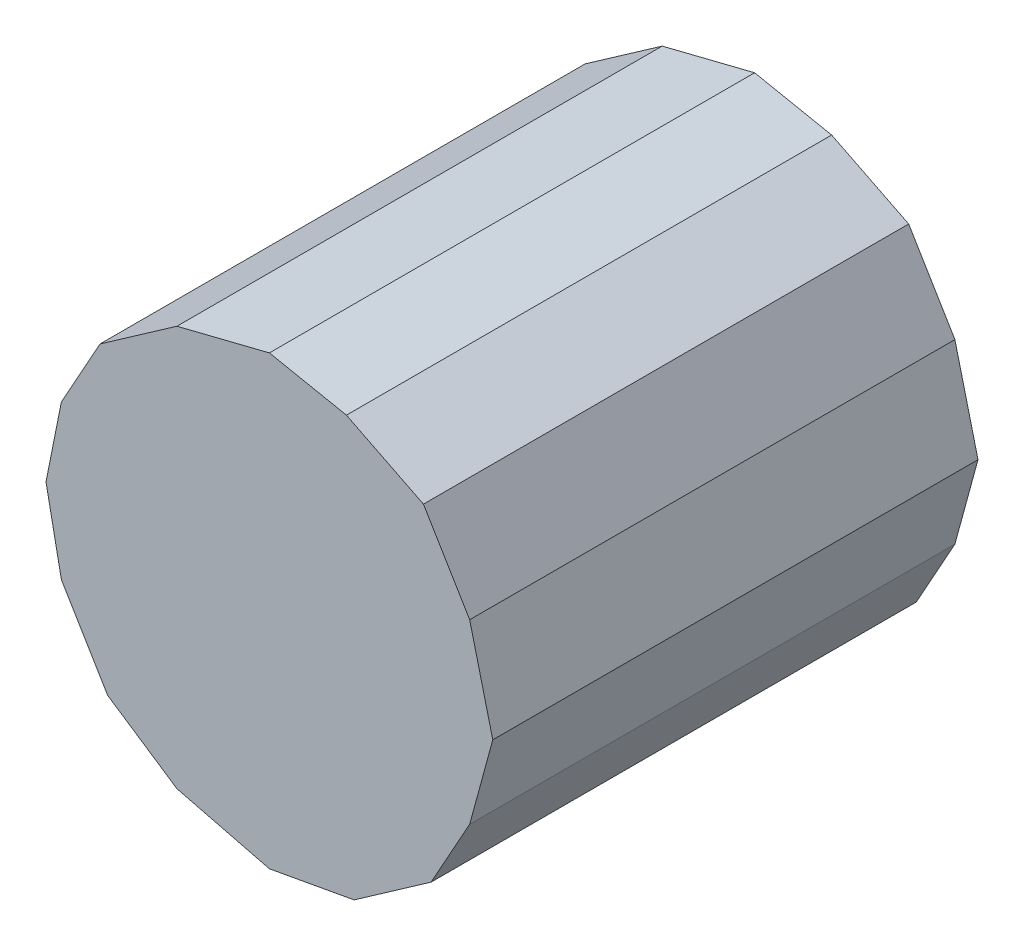
ISO-10303-21;
HEADER;
FILE_DESCRIPTION(('STEP AP214'),'2;1');
FILE_NAME('part.step','',(''),(''),'','','');
FILE_SCHEMA(('AUTOMOTIVE_DESIGN { 1 0 10303 214 1 1 1 1 }'));
ENDSEC;
DATA;
#1=APPLICATION_CONTEXT('core data for automotive mechanical design processes');
#2=APPLICATION_PROTOCOL_DEFINITION('international standard','automotive_design',2000,#1);
#3=PRODUCT_CONTEXT('',#1,'mechanical');
#4=PRODUCT('Part','Part','',(#3));
#5=PRODUCT_RELATED_PRODUCT_CATEGORY('part','',(#4));
#6=PRODUCT_DEFINITION_FORMATION('','',#4);
#7=PRODUCT_DEFINITION_CONTEXT('part definition',#1,'design');
#8=PRODUCT_DEFINITION('design','',#6,#7);
#9=PRODUCT_DEFINITION_SHAPE('','',#8);
#10=(LENGTH_UNIT() NAMED_UNIT(*) SI_UNIT(.MILLI.,.METRE.));
#11=(NAMED_UNIT(*) PLANE_ANGLE_UNIT() SI_UNIT($,.RADIAN.));
#12=(NAMED_UNIT(*) SI_UNIT($,.STERADIAN.) SOLID_ANGLE_UNIT());
#13=UNCERTAINTY_MEASURE_WITH_UNIT(LENGTH_MEASURE(1.E-05),#10,'distance_accuracy_value','');
#14=(GEOMETRIC_REPRESENTATION_CONTEXT(3) GLOBAL_UNCERTAINTY_ASSIGNED_CONTEXT((#13)) GLOBAL_UNIT_ASSIGNED_CONTEXT((#10,
#11,#12)) REPRESENTATION_CONTEXT('',''));
#15=CARTESIAN_POINT('',(0.,0.,0.));
#16=DIRECTION('',(0.,0.,1.));
#17=DIRECTION('',(1.,0.,0.));
#18=AXIS2_PLACEMENT_3D('',#15,#16,#17);
#19=CARTESIAN_POINT('',(0.,3.683,0.));
#20=DIRECTION('',(0.242535625036098,-0.970142500145391,0.));
#21=DIRECTION('',(0.970142500145391,0.242535625036098,0.));
#22=AXIS2_PLACEMENT_3D('',#19,#20,#21);
#23=PLANE('',#22);
#24=DIRECTION('',(0.,0.,1.));
#25=VECTOR('',#24,1.);
#26=CARTESIAN_POINT('',(-1.524,3.302,0.));
#27=LINE('',#26,#25);
#28=CARTESIAN_POINT('',(-1.52400000000005,3.30200000000018,0.));
#29=VERTEX_POINT('',#28);
#30=CARTESIAN_POINT('',(-1.52400000000005,3.30200000000018,8.));
#31=VERTEX_POINT('',#30);
#32=EDGE_CURVE('E140',#29,#31,#27,.T.);
#33=ORIENTED_EDGE('',*,*,#32,.T.);
#34=DIRECTION('',(0.970142500145391,0.242535625036098,0.));
#35=VECTOR('',#34,1.);
#36=CARTESIAN_POINT('',(0.,3.683,8.));
#37=LINE('',#36,#35);
#38=CARTESIAN_POINT('',(0.,3.68299999999994,8.));
#39=VERTEX_POINT('',#38);
#40=EDGE_CURVE('E20',#39,#31,#37,.F.);
#41=ORIENTED_EDGE('',*,*,#40,.F.);
#42=DIRECTION('',(0.,0.,1.));
#43=VECTOR('',#42,1.);
#44=CARTESIAN_POINT('',(0.,3.68299999999975,0.));
#45=LINE('',#44,#43);
#46=CARTESIAN_POINT('',(0.,3.68299999999994,0.));
#47=VERTEX_POINT('',#46);
#48=EDGE_CURVE('E156',#39,#47,#45,.F.);
#49=ORIENTED_EDGE('',*,*,#48,.T.);
#50=DIRECTION('',(0.970142500145391,0.242535625036098,0.));
#51=VECTOR('',#50,1.);
#52=CARTESIAN_POINT('',(0.,3.683,0.));
#53=LINE('',#52,#51);
#54=EDGE_CURVE('E126',#29,#47,#53,.T.);
#55=ORIENTED_EDGE('',*,*,#54,.F.);
#56=EDGE_LOOP('',(#33,#41,#49,#55));
#57=FACE_BOUND('',#56,.T.);
#58=ADVANCED_FACE('F17',(#57),#23,.F.);
#59=CARTESIAN_POINT('',(-1.524,3.302,0.));
#60=DIRECTION('',(0.573462344363127,-0.819231920519181,0.));
#61=DIRECTION('',(0.819231920519181,0.573462344363127,0.));
#62=AXIS2_PLACEMENT_3D('',#59,#60,#61);
#63=PLANE('',#62);
#64=DIRECTION('',(0.,0.,1.));
#65=VECTOR('',#64,1.);
#66=CARTESIAN_POINT('',(-2.794,2.413,0.));
#67=LINE('',#66,#65);
#68=CARTESIAN_POINT('',(-2.79400000000011,2.41300000000016,0.));
#69=VERTEX_POINT('',#68);
#70=CARTESIAN_POINT('',(-2.79400000000011,2.41300000000016,8.));
#71=VERTEX_POINT('',#70);
#72=EDGE_CURVE('E145',#69,#71,#67,.T.);
#73=ORIENTED_EDGE('',*,*,#72,.T.);
#74=DIRECTION('',(0.819231920519181,0.573462344363127,0.));
#75=VECTOR('',#74,1.);
#76=CARTESIAN_POINT('',(-1.524,3.302,8.));
#77=LINE('',#76,#75);
#78=EDGE_CURVE('E134',#31,#71,#77,.F.);
#79=ORIENTED_EDGE('',*,*,#78,.F.);
#80=ORIENTED_EDGE('',*,*,#32,.F.);
#81=DIRECTION('',(0.819231920519181,0.573462344363127,0.));
#82=VECTOR('',#81,1.);
#83=CARTESIAN_POINT('',(-1.524,3.302,0.));
#84=LINE('',#83,#82);
#85=EDGE_CURVE('E147',#69,#29,#84,.T.);
#86=ORIENTED_EDGE('',*,*,#85,.F.);
#87=EDGE_LOOP('',(#73,#79,#80,#86));
#88=FACE_BOUND('',#87,.T.);
#89=ADVANCED_FACE('F143',(#88),#63,.F.);
#90=CARTESIAN_POINT('',(1.27,3.429,0.));
#91=DIRECTION('',(-0.196116135137992,-0.980580675690959,0.));
#92=DIRECTION('',(0.980580675690959,-0.196116135137992,0.));
#93=AXIS2_PLACEMENT_3D('',#90,#91,#92);
#94=PLANE('',#93);
#95=ORIENTED_EDGE('',*,*,#48,.F.);
#96=DIRECTION('',(0.980580675690959,-0.196116135137992,0.));
#97=VECTOR('',#96,1.);
#98=CARTESIAN_POINT('',(1.27,3.429,8.));
#99=LINE('',#98,#97);
#100=CARTESIAN_POINT('',(1.27,3.429,8.));
#101=VERTEX_POINT('',#100);
#102=EDGE_CURVE('E137',#101,#39,#99,.F.);
#103=ORIENTED_EDGE('',*,*,#102,.F.);
#104=DIRECTION('',(0.,0.,1.));
#105=VECTOR('',#104,1.);
#106=CARTESIAN_POINT('',(1.27,3.429,0.));
#107=LINE('',#106,#105);
#108=CARTESIAN_POINT('',(1.27,3.429,0.));
#109=VERTEX_POINT('',#108);
#110=EDGE_CURVE('E161',#101,#109,#107,.F.);
#111=ORIENTED_EDGE('',*,*,#110,.T.);
#112=DIRECTION('',(0.980580675690959,-0.196116135137992,0.));
#113=VECTOR('',#112,1.);
#114=CARTESIAN_POINT('',(1.27,3.429,0.));
#115=LINE('',#114,#113);
#116=EDGE_CURVE('E153',#47,#109,#115,.T.);
#117=ORIENTED_EDGE('',*,*,#116,.F.);
#118=EDGE_LOOP('',(#95,#103,#111,#117));
#119=FACE_BOUND('',#118,.T.);
#120=ADVANCED_FACE('F159',(#119),#94,.F.);
#121=CARTESIAN_POINT('',(-2.794,2.413,0.));
#122=DIRECTION('',(0.874157276121255,-0.485642931179142,0.));
#123=DIRECTION('',(0.485642931179142,0.874157276121255,0.));
#124=AXIS2_PLACEMENT_3D('',#121,#122,#123);
#125=PLANE('',#124);
#126=DIRECTION('',(0.,0.,1.));
#127=VECTOR('',#126,1.);
#128=CARTESIAN_POINT('',(-3.429,1.27,0.));
#129=LINE('',#128,#127);
#130=CARTESIAN_POINT('',(-3.42900000000033,1.27000000000018,0.));
#131=VERTEX_POINT('',#130);
#132=CARTESIAN_POINT('',(-3.42900000000033,1.27000000000018,8.));
#133=VERTEX_POINT('',#132);
#134=EDGE_CURVE('E175',#131,#133,#129,.T.);
#135=ORIENTED_EDGE('',*,*,#134,.T.);
#136=DIRECTION('',(0.485642931179142,0.874157276121255,0.));
#137=VECTOR('',#136,1.);
#138=CARTESIAN_POINT('',(-2.794,2.413,8.));
#139=LINE('',#138,#137);
#140=EDGE_CURVE('E164',#71,#133,#139,.F.);
#141=ORIENTED_EDGE('',*,*,#140,.F.);
#142=ORIENTED_EDGE('',*,*,#72,.F.);
#143=DIRECTION('',(0.485642931179142,0.874157276121255,0.));
#144=VECTOR('',#143,1.);
#145=CARTESIAN_POINT('',(-2.794,2.413,0.));
#146=LINE('',#145,#144);
#147=EDGE_CURVE('E168',#131,#69,#146,.T.);
#148=ORIENTED_EDGE('',*,*,#147,.F.);
#149=EDGE_LOOP('',(#135,#141,#142,#148));
#150=FACE_BOUND('',#149,.T.);
#151=ADVANCED_FACE('F285',(#150),#125,.F.);
#152=CARTESIAN_POINT('',(2.54,2.794,0.));
#153=DIRECTION('',(-0.447213595499958,-0.894427190999916,0.));
#154=DIRECTION('',(0.894427190999916,-0.447213595499958,0.));
#155=AXIS2_PLACEMENT_3D('',#152,#153,#154);
#156=PLANE('',#155);
#157=ORIENTED_EDGE('',*,*,#110,.F.);
#158=DIRECTION('',(0.894427190999916,-0.447213595499958,0.));
#159=VECTOR('',#158,1.);
#160=CARTESIAN_POINT('',(2.54,2.794,8.));
#161=LINE('',#160,#159);
#162=CARTESIAN_POINT('',(2.53999999999978,2.79399999999987,8.));
#163=VERTEX_POINT('',#162);
#164=EDGE_CURVE('E170',#163,#101,#161,.F.);
#165=ORIENTED_EDGE('',*,*,#164,.F.);
#166=DIRECTION('',(0.,0.,1.));
#167=VECTOR('',#166,1.);
#168=CARTESIAN_POINT('',(2.53999999999913,2.79399999999948,0.));
#169=LINE('',#168,#167);
#170=CARTESIAN_POINT('',(2.53999999999978,2.79399999999987,0.));
#171=VERTEX_POINT('',#170);
#172=EDGE_CURVE('E185',#163,#171,#169,.F.);
#173=ORIENTED_EDGE('',*,*,#172,.T.);
#174=DIRECTION('',(0.894427190999916,-0.447213595499958,0.));
#175=VECTOR('',#174,1.);
#176=CARTESIAN_POINT('',(2.54,2.794,0.));
#177=LINE('',#176,#175);
#178=EDGE_CURVE('E173',#109,#171,#177,.T.);
#179=ORIENTED_EDGE('',*,*,#178,.F.);
#180=EDGE_LOOP('',(#157,#165,#173,#179));
#181=FACE_BOUND('',#180,.T.);
#182=ADVANCED_FACE('F307',(#181),#156,.F.);
#183=CARTESIAN_POINT('',(-3.429,1.27,0.));
#184=DIRECTION('',(0.980580675690959,-0.196116135137992,0.));
#185=DIRECTION('',(0.196116135137992,0.980580675690959,0.));
#186=AXIS2_PLACEMENT_3D('',#183,#184,#185);
#187=PLANE('',#186);
#188=DIRECTION('',(0.,0.,1.));
#189=VECTOR('',#188,1.);
#190=CARTESIAN_POINT('',(-3.683,0.,0.));
#191=LINE('',#190,#189);
#192=CARTESIAN_POINT('',(-3.68299999999988,0.,0.));
#193=VERTEX_POINT('',#192);
#194=CARTESIAN_POINT('',(-3.68299999999988,0.,8.));
#195=VERTEX_POINT('',#194);
#196=EDGE_CURVE('E190',#193,#195,#191,.T.);
#197=ORIENTED_EDGE('',*,*,#196,.T.);
#198=DIRECTION('',(0.196116135137992,0.980580675690959,0.));
#199=VECTOR('',#198,1.);
#200=CARTESIAN_POINT('',(-3.429,1.27,8.));
#201=LINE('',#200,#199);
#202=EDGE_CURVE('E178',#133,#195,#201,.F.);
#203=ORIENTED_EDGE('',*,*,#202,.F.);
#204=ORIENTED_EDGE('',*,*,#134,.F.);
#205=DIRECTION('',(0.196116135137992,0.980580675690959,0.));
#206=VECTOR('',#205,1.);
#207=CARTESIAN_POINT('',(-3.429,1.27,0.));
#208=LINE('',#207,#206);
#209=EDGE_CURVE('E180',#193,#131,#208,.T.);
#210=ORIENTED_EDGE('',*,*,#209,.F.);
#211=EDGE_LOOP('',(#197,#203,#204,#210));
#212=FACE_BOUND('',#211,.T.);
#213=ADVANCED_FACE('F283',(#212),#187,.F.);
#214=CARTESIAN_POINT('',(3.302,1.524,0.));
#215=DIRECTION('',(-0.857492925712191,-0.514495755428115,0.));
#216=DIRECTION('',(0.514495755428115,-0.857492925712191,0.));
#217=AXIS2_PLACEMENT_3D('',#214,#215,#216);
#218=PLANE('',#217);
#219=ORIENTED_EDGE('',*,*,#172,.F.);
#220=DIRECTION('',(0.514495755428115,-0.857492925712191,0.));
#221=VECTOR('',#220,1.);
#222=CARTESIAN_POINT('',(3.302,1.524,8.));
#223=LINE('',#222,#221);
#224=CARTESIAN_POINT('',(3.30200000000009,1.52400000000002,8.));
#225=VERTEX_POINT('',#224);
#226=EDGE_CURVE('E183',#225,#163,#223,.F.);
#227=ORIENTED_EDGE('',*,*,#226,.F.);
#228=DIRECTION('',(0.,0.,1.));
#229=VECTOR('',#228,1.);
#230=CARTESIAN_POINT('',(3.30200000000037,1.52400000000009,0.));
#231=LINE('',#230,#229);
#232=CARTESIAN_POINT('',(3.30200000000009,1.52400000000002,0.));
#233=VERTEX_POINT('',#232);
#234=EDGE_CURVE('E200',#225,#233,#231,.F.);
#235=ORIENTED_EDGE('',*,*,#234,.T.);
#236=DIRECTION('',(0.514495755428115,-0.857492925712191,0.));
#237=VECTOR('',#236,1.);
#238=CARTESIAN_POINT('',(3.302,1.524,0.));
#239=LINE('',#238,#237);
#240=EDGE_CURVE('E188',#171,#233,#239,.T.);
#241=ORIENTED_EDGE('',*,*,#240,.F.);
#242=EDGE_LOOP('',(#219,#227,#235,#241));
#243=FACE_BOUND('',#242,.T.);
#244=ADVANCED_FACE('F304',(#243),#218,.F.);
#245=CARTESIAN_POINT('',(-3.683,0.,0.));
#246=DIRECTION('',(0.980580675690959,0.196116135137992,0.));
#247=DIRECTION('',(-0.196116135137992,0.980580675690959,0.));
#248=AXIS2_PLACEMENT_3D('',#245,#246,#247);
#249=PLANE('',#248);
#250=DIRECTION('',(0.,0.,1.));
#251=VECTOR('',#250,1.);
#252=CARTESIAN_POINT('',(-3.429,-1.27,0.));
#253=LINE('',#252,#251);
#254=CARTESIAN_POINT('',(-3.42900000000012,-1.27000000000003,0.));
#255=VERTEX_POINT('',#254);
#256=CARTESIAN_POINT('',(-3.42900000000012,-1.27000000000003,8.));
#257=VERTEX_POINT('',#256);
#258=EDGE_CURVE('E205',#255,#257,#253,.T.);
#259=ORIENTED_EDGE('',*,*,#258,.T.);
#260=DIRECTION('',(-0.196116135137992,0.980580675690959,0.));
#261=VECTOR('',#260,1.);
#262=CARTESIAN_POINT('',(-3.683,0.,8.));
#263=LINE('',#262,#261);
#264=EDGE_CURVE('E193',#195,#257,#263,.F.);
#265=ORIENTED_EDGE('',*,*,#264,.F.);
#266=ORIENTED_EDGE('',*,*,#196,.F.);
#267=DIRECTION('',(-0.196116135137992,0.980580675690959,0.));
#268=VECTOR('',#267,1.);
#269=CARTESIAN_POINT('',(-3.683,0.,0.));
#270=LINE('',#269,#268);
#271=EDGE_CURVE('E195',#255,#193,#270,.T.);
#272=ORIENTED_EDGE('',*,*,#271,.F.);
#273=EDGE_LOOP('',(#259,#265,#266,#272));
#274=FACE_BOUND('',#273,.T.);
#275=ADVANCED_FACE('F280',(#274),#249,.F.);
#276=CARTESIAN_POINT('',(3.683,0.,0.));
#277=DIRECTION('',(-0.970142500145391,-0.242535625036098,0.));
#278=DIRECTION('',(0.242535625036098,-0.970142500145391,0.));
#279=AXIS2_PLACEMENT_3D('',#276,#277,#278);
#280=PLANE('',#279);
#281=ORIENTED_EDGE('',*,*,#234,.F.);
#282=DIRECTION('',(0.242535625036098,-0.970142500145391,0.));
#283=VECTOR('',#282,1.);
#284=CARTESIAN_POINT('',(3.683,0.,8.));
#285=LINE('',#284,#283);
#286=CARTESIAN_POINT('',(3.68299999999994,0.,8.));
#287=VERTEX_POINT('',#286);
#288=EDGE_CURVE('E198',#287,#225,#285,.F.);
#289=ORIENTED_EDGE('',*,*,#288,.F.);
#290=DIRECTION('',(0.,0.,1.));
#291=VECTOR('',#290,1.);
#292=CARTESIAN_POINT('',(3.68299999999976,0.,0.));
#293=LINE('',#292,#291);
#294=CARTESIAN_POINT('',(3.68299999999994,0.,0.));
#295=VERTEX_POINT('',#294);
#296=EDGE_CURVE('E215',#287,#295,#293,.F.);
#297=ORIENTED_EDGE('',*,*,#296,.T.);
#298=DIRECTION('',(0.242535625036098,-0.970142500145391,0.));
#299=VECTOR('',#298,1.);
#300=CARTESIAN_POINT('',(3.683,0.,0.));
#301=LINE('',#300,#299);
#302=EDGE_CURVE('E203',#233,#295,#301,.T.);
#303=ORIENTED_EDGE('',*,*,#302,.F.);
#304=EDGE_LOOP('',(#281,#289,#297,#303));
#305=FACE_BOUND('',#304,.T.);
#306=ADVANCED_FACE('F299',(#305),#280,.F.);
#307=CARTESIAN_POINT('',(-3.429,-1.27,0.));
#308=DIRECTION('',(0.857492925712191,0.514495755428115,0.));
#309=DIRECTION('',(-0.514495755428115,0.857492925712191,0.));
#310=AXIS2_PLACEMENT_3D('',#307,#308,#309);
#311=PLANE('',#310);
#312=DIRECTION('',(0.,0.,1.));
#313=VECTOR('',#312,1.);
#314=CARTESIAN_POINT('',(-2.667,-2.54,0.));
#315=LINE('',#314,#313);
#316=CARTESIAN_POINT('',(-2.66699999999956,-2.53999999999974,0.));
#317=VERTEX_POINT('',#316);
#318=CARTESIAN_POINT('',(-2.66699999999956,-2.53999999999974,8.));
#319=VERTEX_POINT('',#318);
#320=EDGE_CURVE('E220',#317,#319,#315,.T.);
#321=ORIENTED_EDGE('',*,*,#320,.T.);
#322=DIRECTION('',(-0.514495755428115,0.857492925712191,0.));
#323=VECTOR('',#322,1.);
#324=CARTESIAN_POINT('',(-3.429,-1.27,8.));
#325=LINE('',#324,#323);
#326=EDGE_CURVE('E208',#257,#319,#325,.F.);
#327=ORIENTED_EDGE('',*,*,#326,.F.);
#328=ORIENTED_EDGE('',*,*,#258,.F.);
#329=DIRECTION('',(-0.514495755428115,0.857492925712191,0.));
#330=VECTOR('',#329,1.);
#331=CARTESIAN_POINT('',(-3.429,-1.27,0.));
#332=LINE('',#331,#330);
#333=EDGE_CURVE('E210',#317,#255,#332,.T.);
#334=ORIENTED_EDGE('',*,*,#333,.F.);
#335=EDGE_LOOP('',(#321,#327,#328,#334));
#336=FACE_BOUND('',#335,.T.);
#337=ADVANCED_FACE('F274',(#336),#311,.F.);
#338=CARTESIAN_POINT('',(3.302,-1.397,0.));
#339=DIRECTION('',(-0.964763821237778,0.26311740579194,0.));
#340=DIRECTION('',(-0.26311740579194,-0.964763821237778,0.));
#341=AXIS2_PLACEMENT_3D('',#338,#339,#340);
#342=PLANE('',#341);
#343=ORIENTED_EDGE('',*,*,#296,.F.);
#344=DIRECTION('',(-0.26311740579194,-0.964763821237778,0.));
#345=VECTOR('',#344,1.);
#346=CARTESIAN_POINT('',(3.302,-1.397,8.));
#347=LINE('',#346,#345);
#348=CARTESIAN_POINT('',(3.30200000000017,-1.39700000000009,8.));
#349=VERTEX_POINT('',#348);
#350=EDGE_CURVE('E213',#349,#287,#347,.F.);
#351=ORIENTED_EDGE('',*,*,#350,.F.);
#352=DIRECTION('',(0.,0.,1.));
#353=VECTOR('',#352,1.);
#354=CARTESIAN_POINT('',(3.30200000000067,-1.39700000000037,0.));
#355=LINE('',#354,#353);
#356=CARTESIAN_POINT('',(3.30200000000017,-1.39700000000009,0.));
#357=VERTEX_POINT('',#356);
#358=EDGE_CURVE('E228',#349,#357,#355,.F.);
#359=ORIENTED_EDGE('',*,*,#358,.T.);
#360=DIRECTION('',(-0.26311740579194,-0.964763821237778,0.));
#361=VECTOR('',#360,1.);
#362=CARTESIAN_POINT('',(3.302,-1.397,0.));
#363=LINE('',#362,#361);
#364=EDGE_CURVE('E218',#295,#357,#363,.T.);
#365=ORIENTED_EDGE('',*,*,#364,.F.);
#366=EDGE_LOOP('',(#343,#351,#359,#365));
#367=FACE_BOUND('',#366,.T.);
#368=ADVANCED_FACE('F294',(#367),#342,.F.);
#369=CARTESIAN_POINT('',(-2.667,-2.54,0.));
#370=DIRECTION('',(0.554700196224998,0.832050294337997,0.));
#371=DIRECTION('',(-0.832050294337997,0.554700196224998,0.));
#372=AXIS2_PLACEMENT_3D('',#369,#370,#371);
#373=PLANE('',#372);
#374=DIRECTION('',(0.,0.,1.));
#375=VECTOR('',#374,1.);
#376=CARTESIAN_POINT('',(-1.524,-3.302,0.));
#377=LINE('',#376,#375);
#378=CARTESIAN_POINT('',(-1.52399999999989,-3.30199999999984,0.));
#379=VERTEX_POINT('',#378);
#380=CARTESIAN_POINT('',(-1.52399999999989,-3.30199999999984,8.));
#381=VERTEX_POINT('',#380);
#382=EDGE_CURVE('E233',#379,#381,#377,.T.);
#383=ORIENTED_EDGE('',*,*,#382,.T.);
#384=DIRECTION('',(-0.832050294337997,0.554700196224998,0.));
#385=VECTOR('',#384,1.);
#386=CARTESIAN_POINT('',(-2.667,-2.54,8.));
#387=LINE('',#386,#385);
#388=EDGE_CURVE('E223',#319,#381,#387,.F.);
#389=ORIENTED_EDGE('',*,*,#388,.F.);
#390=ORIENTED_EDGE('',*,*,#320,.F.);
#391=DIRECTION('',(-0.832050294337997,0.554700196224998,0.));
#392=VECTOR('',#391,1.);
#393=CARTESIAN_POINT('',(-2.667,-2.54,0.));
#394=LINE('',#393,#392);
#395=EDGE_CURVE('E225',#379,#317,#394,.T.);
#396=ORIENTED_EDGE('',*,*,#395,.F.);
#397=EDGE_LOOP('',(#383,#389,#390,#396));
#398=FACE_BOUND('',#397,.T.);
#399=ADVANCED_FACE('F271',(#398),#373,.F.);
#400=CARTESIAN_POINT('',(2.667,-2.54,0.));
#401=DIRECTION('',(-0.874157276121255,0.485642931179142,0.));
#402=DIRECTION('',(-0.485642931179142,-0.874157276121255,0.));
#403=AXIS2_PLACEMENT_3D('',#400,#401,#402);
#404=PLANE('',#403);
#405=ORIENTED_EDGE('',*,*,#358,.F.);
#406=DIRECTION('',(-0.485642931178632,-0.874157276121538,0.));
#407=VECTOR('',#406,1.);
#408=CARTESIAN_POINT('',(3.302,-1.397,8.));
#409=LINE('',#408,#407);
#410=CARTESIAN_POINT('',(2.66700000000005,-2.54000000000008,8.));
#411=VERTEX_POINT('',#410);
#412=EDGE_CURVE('E242',#349,#411,#409,.T.);
#413=ORIENTED_EDGE('',*,*,#412,.T.);
#414=DIRECTION('',(0.,0.,1.));
#415=VECTOR('',#414,1.);
#416=CARTESIAN_POINT('',(2.66700000000022,-2.54000000000031,0.));
#417=LINE('',#416,#415);
#418=CARTESIAN_POINT('',(2.66700000000005,-2.54000000000008,0.));
#419=VERTEX_POINT('',#418);
#420=EDGE_CURVE('E246',#411,#419,#417,.F.);
#421=ORIENTED_EDGE('',*,*,#420,.T.);
#422=DIRECTION('',(-0.485642931179142,-0.874157276121255,0.));
#423=VECTOR('',#422,1.);
#424=CARTESIAN_POINT('',(2.667,-2.54,0.));
#425=LINE('',#424,#423);
#426=EDGE_CURVE('E231',#357,#419,#425,.T.);
#427=ORIENTED_EDGE('',*,*,#426,.F.);
#428=EDGE_LOOP('',(#405,#413,#421,#427));
#429=FACE_BOUND('',#428,.T.);
#430=ADVANCED_FACE('F290',(#429),#404,.F.);
#431=CARTESIAN_POINT('',(-1.524,-3.302,0.));
#432=DIRECTION('',(0.242535625036098,0.970142500145391,0.));
#433=DIRECTION('',(-0.970142500145391,0.242535625036098,0.));
#434=AXIS2_PLACEMENT_3D('',#431,#432,#433);
#435=PLANE('',#434);
#436=DIRECTION('',(0.,0.,1.));
#437=VECTOR('',#436,1.);
#438=CARTESIAN_POINT('',(0.,-3.683,0.));
#439=LINE('',#438,#437);
#440=CARTESIAN_POINT('',(0.,-3.68299999999982,0.));
#441=VERTEX_POINT('',#440);
#442=CARTESIAN_POINT('',(0.,-3.68299999999982,8.));
#443=VERTEX_POINT('',#442);
#444=EDGE_CURVE('E250',#441,#443,#439,.T.);
#445=ORIENTED_EDGE('',*,*,#444,.T.);
#446=DIRECTION('',(-0.970142500145332,0.242535625036333,0.));
#447=VECTOR('',#446,1.);
#448=CARTESIAN_POINT('',(0.,-3.683,8.));
#449=LINE('',#448,#447);
#450=EDGE_CURVE('E239',#443,#381,#449,.T.);
#451=ORIENTED_EDGE('',*,*,#450,.T.);
#452=ORIENTED_EDGE('',*,*,#382,.F.);
#453=DIRECTION('',(-0.970142500145391,0.242535625036098,0.));
#454=VECTOR('',#453,1.);
#455=CARTESIAN_POINT('',(-1.524,-3.302,0.));
#456=LINE('',#455,#454);
#457=EDGE_CURVE('E236',#441,#379,#456,.T.);
#458=ORIENTED_EDGE('',*,*,#457,.F.);
#459=EDGE_LOOP('',(#445,#451,#452,#458));
#460=FACE_BOUND('',#459,.T.);
#461=ADVANCED_FACE('F267',(#460),#435,.F.);
#462=CARTESIAN_POINT('',(0.,-3.683,8.));
#463=DIRECTION('',(0.,0.,-1.));
#464=DIRECTION('',(-1.,0.,0.));
#465=AXIS2_PLACEMENT_3D('',#462,#463,#464);
#466=PLANE('',#465);
#467=DIRECTION('',(-0.819231920519181,-0.573462344363127,0.));
#468=VECTOR('',#467,1.);
#469=CARTESIAN_POINT('',(1.397,-3.429,8.));
#470=LINE('',#469,#468);
#471=CARTESIAN_POINT('',(1.397,-3.429,8.));
#472=VERTEX_POINT('',#471);
#473=EDGE_CURVE('E244',#472,#411,#470,.F.);
#474=ORIENTED_EDGE('',*,*,#473,.T.);
#475=ORIENTED_EDGE('',*,*,#412,.F.);
#476=ORIENTED_EDGE('',*,*,#350,.T.);
#477=ORIENTED_EDGE('',*,*,#288,.T.);
#478=ORIENTED_EDGE('',*,*,#226,.T.);
#479=ORIENTED_EDGE('',*,*,#164,.T.);
#480=ORIENTED_EDGE('',*,*,#102,.T.);
#481=ORIENTED_EDGE('',*,*,#40,.T.);
#482=ORIENTED_EDGE('',*,*,#78,.T.);
#483=ORIENTED_EDGE('',*,*,#140,.T.);
#484=ORIENTED_EDGE('',*,*,#202,.T.);
#485=ORIENTED_EDGE('',*,*,#264,.T.);
#486=ORIENTED_EDGE('',*,*,#326,.T.);
#487=ORIENTED_EDGE('',*,*,#388,.T.);
#488=ORIENTED_EDGE('',*,*,#450,.F.);
#489=DIRECTION('',(-0.983869910099907,-0.178885438199983,0.));
#490=VECTOR('',#489,1.);
#491=CARTESIAN_POINT('',(0.,-3.683,8.));
#492=LINE('',#491,#490);
#493=EDGE_CURVE('E252',#443,#472,#492,.F.);
#494=ORIENTED_EDGE('',*,*,#493,.T.);
#495=EDGE_LOOP('',(#474,#475,#476,#477,#478,#479,#480,#481,#482,#483,#484,#485,#486,#487,#488,#494));
#496=FACE_BOUND('',#495,.T.);
#497=ADVANCED_FACE('F132',(#496),#466,.F.);
#498=CARTESIAN_POINT('',(1.397,-3.429,0.));
#499=DIRECTION('',(-0.573462344363127,0.819231920519181,0.));
#500=DIRECTION('',(-0.819231920519181,-0.573462344363127,0.));
#501=AXIS2_PLACEMENT_3D('',#498,#499,#500);
#502=PLANE('',#501);
#503=ORIENTED_EDGE('',*,*,#420,.F.);
#504=ORIENTED_EDGE('',*,*,#473,.F.);
#505=DIRECTION('',(0.,0.,1.));
#506=VECTOR('',#505,1.);
#507=CARTESIAN_POINT('',(1.397,-3.429,0.));
#508=LINE('',#507,#506);
#509=CARTESIAN_POINT('',(1.397,-3.429,0.));
#510=VERTEX_POINT('',#509);
#511=EDGE_CURVE('E26',#472,#510,#508,.F.);
#512=ORIENTED_EDGE('',*,*,#511,.T.);
#513=DIRECTION('',(-0.819231920519181,-0.573462344363127,0.));
#514=VECTOR('',#513,1.);
#515=CARTESIAN_POINT('',(1.397,-3.429,0.));
#516=LINE('',#515,#514);
#517=EDGE_CURVE('E34',#419,#510,#516,.T.);
#518=ORIENTED_EDGE('',*,*,#517,.F.);
#519=EDGE_LOOP('',(#503,#504,#512,#518));
#520=FACE_BOUND('',#519,.T.);
#521=ADVANCED_FACE('F259',(#520),#502,.F.);
#522=CARTESIAN_POINT('',(0.,-3.683,0.));
#523=DIRECTION('',(-0.178885438199983,0.983869910099907,0.));
#524=DIRECTION('',(-0.983869910099907,-0.178885438199983,0.));
#525=AXIS2_PLACEMENT_3D('',#522,#523,#524);
#526=PLANE('',#525);
#527=ORIENTED_EDGE('',*,*,#511,.F.);
#528=ORIENTED_EDGE('',*,*,#493,.F.);
#529=ORIENTED_EDGE('',*,*,#444,.F.);
#530=DIRECTION('',(-0.983869910099907,-0.178885438199983,0.));
#531=VECTOR('',#530,1.);
#532=CARTESIAN_POINT('',(1.397,-3.429,0.));
#533=LINE('',#532,#531);
#534=EDGE_CURVE('E11',#510,#441,#533,.T.);
#535=ORIENTED_EDGE('',*,*,#534,.F.);
#536=EDGE_LOOP('',(#527,#528,#529,#535));
#537=FACE_BOUND('',#536,.T.);
#538=ADVANCED_FACE('F263',(#537),#526,.F.);
#539=CARTESIAN_POINT('',(0.,-3.683,0.));
#540=DIRECTION('',(0.,0.,-1.));
#541=DIRECTION('',(-1.,0.,0.));
#542=AXIS2_PLACEMENT_3D('',#539,#540,#541);
#543=PLANE('',#542);
#544=ORIENTED_EDGE('',*,*,#517,.T.);
#545=ORIENTED_EDGE('',*,*,#534,.T.);
#546=ORIENTED_EDGE('',*,*,#457,.T.);
#547=ORIENTED_EDGE('',*,*,#395,.T.);
#548=ORIENTED_EDGE('',*,*,#333,.T.);
#549=ORIENTED_EDGE('',*,*,#271,.T.);
#550=ORIENTED_EDGE('',*,*,#209,.T.);
#551=ORIENTED_EDGE('',*,*,#147,.T.);
#552=ORIENTED_EDGE('',*,*,#85,.T.);
#553=ORIENTED_EDGE('',*,*,#54,.T.);
#554=ORIENTED_EDGE('',*,*,#116,.T.);
#555=ORIENTED_EDGE('',*,*,#178,.T.);
#556=ORIENTED_EDGE('',*,*,#240,.T.);
#557=ORIENTED_EDGE('',*,*,#302,.T.);
#558=ORIENTED_EDGE('',*,*,#364,.T.);
#559=ORIENTED_EDGE('',*,*,#426,.T.);
#560=EDGE_LOOP('',(#544,#545,#546,#547,#548,#549,#550,#551,#552,#553,#554,#555,#556,#557,#558,#559));
#561=FACE_BOUND('',#560,.T.);
#562=ADVANCED_FACE('F151',(#561),#543,.T.);
#563=CLOSED_SHELL('',(#58,#89,#120,#151,#182,#213,#244,#275,#306,#337,#368,#399,#430,#461,#497,
#521,#538,#562));
#564=MANIFOLD_SOLID_BREP('B1',#563);
#565=ADVANCED_BREP_SHAPE_REPRESENTATION('',(#18,#564),#14);
#566=SHAPE_DEFINITION_REPRESENTATION(#9,#565);
ENDSEC;
END-ISO-10303-21;
